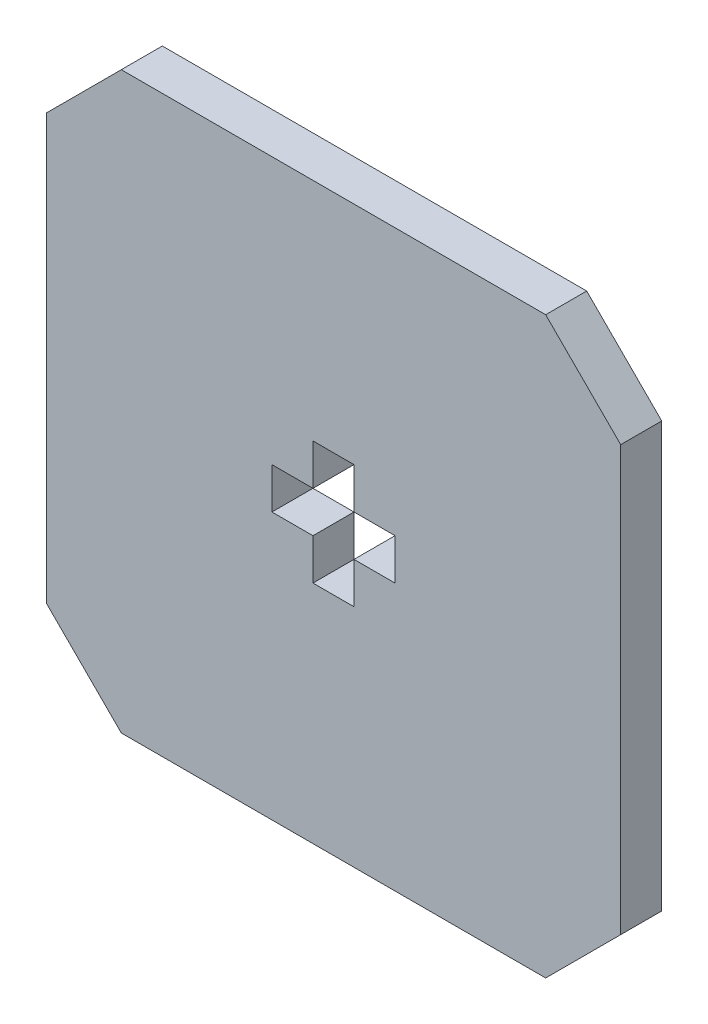
ISO-10303-21;
HEADER;
FILE_DESCRIPTION(('STEP AP214'),'2;1');
FILE_NAME('part.step','',(''),(''),'','','');
FILE_SCHEMA(('AUTOMOTIVE_DESIGN { 1 0 10303 214 1 1 1 1 }'));
ENDSEC;
DATA;
#1=APPLICATION_CONTEXT('core data for automotive mechanical design processes');
#2=APPLICATION_PROTOCOL_DEFINITION('international standard','automotive_design',2000,#1);
#3=PRODUCT_CONTEXT('',#1,'mechanical');
#4=PRODUCT('Part','Part','',(#3));
#5=PRODUCT_RELATED_PRODUCT_CATEGORY('part','',(#4));
#6=PRODUCT_DEFINITION_FORMATION('','',#4);
#7=PRODUCT_DEFINITION_CONTEXT('part definition',#1,'design');
#8=PRODUCT_DEFINITION('design','',#6,#7);
#9=PRODUCT_DEFINITION_SHAPE('','',#8);
#10=(LENGTH_UNIT() NAMED_UNIT(*) SI_UNIT(.MILLI.,.METRE.));
#11=(NAMED_UNIT(*) PLANE_ANGLE_UNIT() SI_UNIT($,.RADIAN.));
#12=(NAMED_UNIT(*) SI_UNIT($,.STERADIAN.) SOLID_ANGLE_UNIT());
#13=UNCERTAINTY_MEASURE_WITH_UNIT(LENGTH_MEASURE(1.E-05),#10,'distance_accuracy_value','');
#14=(GEOMETRIC_REPRESENTATION_CONTEXT(3) GLOBAL_UNCERTAINTY_ASSIGNED_CONTEXT((#13)) GLOBAL_UNIT_ASSIGNED_CONTEXT((#10,
#11,#12)) REPRESENTATION_CONTEXT('',''));
#15=CARTESIAN_POINT('',(0.,0.,0.));
#16=DIRECTION('',(0.,0.,1.));
#17=DIRECTION('',(1.,0.,0.));
#18=AXIS2_PLACEMENT_3D('',#15,#16,#17);
#19=CARTESIAN_POINT('',(0.,0.,3.));
#20=DIRECTION('',(0.,0.,-1.));
#21=DIRECTION('',(-1.,0.,0.));
#22=AXIS2_PLACEMENT_3D('',#19,#20,#21);
#23=PLANE('',#22);
#24=DIRECTION('',(0.707106781186548,0.707106781186548,0.));
#25=VECTOR('',#24,1.);
#26=CARTESIAN_POINT('',(432.000004860086,260.485276584416,3.));
#27=LINE('',#26,#25);
#28=CARTESIAN_POINT('',(426.514723485886,254.999995210216,3.));
#29=VERTEX_POINT('',#28);
#30=CARTESIAN_POINT('',(432.000004860086,260.485276584416,3.));
#31=VERTEX_POINT('',#30);
#32=EDGE_CURVE('E264',#29,#31,#27,.T.);
#33=ORIENTED_EDGE('',*,*,#32,.T.);
#34=DIRECTION('',(0.,1.,0.));
#35=VECTOR('',#34,1.);
#36=CARTESIAN_POINT('',(432.000004860086,291.514713836016,3.));
#37=LINE('',#36,#35);
#38=CARTESIAN_POINT('',(432.000004860086,291.514713836016,3.));
#39=VERTEX_POINT('',#38);
#40=EDGE_CURVE('E267',#31,#39,#37,.T.);
#41=ORIENTED_EDGE('',*,*,#40,.T.);
#42=DIRECTION('',(-0.707106781186544,0.707106781186551,0.));
#43=VECTOR('',#42,1.);
#44=CARTESIAN_POINT('',(426.514723485886,296.999995210216,3.));
#45=LINE('',#44,#43);
#46=CARTESIAN_POINT('',(426.514723485886,296.999995210216,3.));
#47=VERTEX_POINT('',#46);
#48=EDGE_CURVE('E270',#39,#47,#45,.T.);
#49=ORIENTED_EDGE('',*,*,#48,.T.);
#50=DIRECTION('',(-1.,0.,0.));
#51=VECTOR('',#50,1.);
#52=CARTESIAN_POINT('',(395.485286234286,296.999995210216,3.));
#53=LINE('',#52,#51);
#54=CARTESIAN_POINT('',(395.485286234286,296.999995210216,3.));
#55=VERTEX_POINT('',#54);
#56=EDGE_CURVE('E272',#47,#55,#53,.T.);
#57=ORIENTED_EDGE('',*,*,#56,.T.);
#58=DIRECTION('',(-0.707106781186544,-0.707106781186551,0.));
#59=VECTOR('',#58,1.);
#60=CARTESIAN_POINT('',(390.000004860086,291.514713836016,3.));
#61=LINE('',#60,#59);
#62=CARTESIAN_POINT('',(390.000004860086,291.514713836016,3.));
#63=VERTEX_POINT('',#62);
#64=EDGE_CURVE('E274',#55,#63,#61,.T.);
#65=ORIENTED_EDGE('',*,*,#64,.T.);
#66=DIRECTION('',(0.,-1.,0.));
#67=VECTOR('',#66,1.);
#68=CARTESIAN_POINT('',(390.000004860086,260.485276584416,3.));
#69=LINE('',#68,#67);
#70=CARTESIAN_POINT('',(390.000004860086,260.485276584416,3.));
#71=VERTEX_POINT('',#70);
#72=EDGE_CURVE('E276',#63,#71,#69,.T.);
#73=ORIENTED_EDGE('',*,*,#72,.T.);
#74=DIRECTION('',(0.707106781186548,-0.707106781186548,0.));
#75=VECTOR('',#74,1.);
#76=CARTESIAN_POINT('',(395.485286234286,254.999995210216,3.));
#77=LINE('',#76,#75);
#78=CARTESIAN_POINT('',(395.485286234286,254.999995210216,3.));
#79=VERTEX_POINT('',#78);
#80=EDGE_CURVE('E278',#71,#79,#77,.T.);
#81=ORIENTED_EDGE('',*,*,#80,.T.);
#82=DIRECTION('',(1.,0.,0.));
#83=VECTOR('',#82,1.);
#84=CARTESIAN_POINT('',(426.514723485886,254.999995210216,3.));
#85=LINE('',#84,#83);
#86=EDGE_CURVE('E280',#79,#29,#85,.T.);
#87=ORIENTED_EDGE('',*,*,#86,.T.);
#88=EDGE_LOOP('',(#33,#41,#49,#57,#65,#73,#81,#87));
#89=FACE_BOUND('',#88,.T.);
#90=DIRECTION('',(-1.,0.,0.));
#91=VECTOR('',#90,1.);
#92=CARTESIAN_POINT('',(409.500004860086,280.499995210216,3.));
#93=LINE('',#92,#91);
#94=CARTESIAN_POINT('',(412.500004860086,280.499995210216,3.));
#95=VERTEX_POINT('',#94);
#96=CARTESIAN_POINT('',(409.500004860086,280.499995210216,3.));
#97=VERTEX_POINT('',#96);
#98=EDGE_CURVE('E171',#95,#97,#93,.T.);
#99=ORIENTED_EDGE('',*,*,#98,.F.);
#100=DIRECTION('',(0.,1.,0.));
#101=VECTOR('',#100,1.);
#102=CARTESIAN_POINT('',(412.500004860086,280.499995210216,3.));
#103=LINE('',#102,#101);
#104=CARTESIAN_POINT('',(412.500004860086,277.499995210216,3.));
#105=VERTEX_POINT('',#104);
#106=EDGE_CURVE('E212',#105,#95,#103,.T.);
#107=ORIENTED_EDGE('',*,*,#106,.F.);
#108=DIRECTION('',(-1.,0.,0.));
#109=VECTOR('',#108,1.);
#110=CARTESIAN_POINT('',(412.500004860086,277.499995210216,3.));
#111=LINE('',#110,#109);
#112=CARTESIAN_POINT('',(415.500004860086,277.499995210216,3.));
#113=VERTEX_POINT('',#112);
#114=EDGE_CURVE('E210',#113,#105,#111,.T.);
#115=ORIENTED_EDGE('',*,*,#114,.F.);
#116=DIRECTION('',(0.,1.,0.));
#117=VECTOR('',#116,1.);
#118=CARTESIAN_POINT('',(415.500004860086,277.499995210216,3.));
#119=LINE('',#118,#117);
#120=CARTESIAN_POINT('',(415.500004860086,274.499995210216,3.));
#121=VERTEX_POINT('',#120);
#122=EDGE_CURVE('E208',#121,#113,#119,.T.);
#123=ORIENTED_EDGE('',*,*,#122,.F.);
#124=DIRECTION('',(1.,0.,0.));
#125=VECTOR('',#124,1.);
#126=CARTESIAN_POINT('',(415.500004860086,274.499995210216,3.));
#127=LINE('',#126,#125);
#128=CARTESIAN_POINT('',(412.500004860086,274.499995210216,3.));
#129=VERTEX_POINT('',#128);
#130=EDGE_CURVE('E206',#129,#121,#127,.T.);
#131=ORIENTED_EDGE('',*,*,#130,.F.);
#132=DIRECTION('',(0.,1.,0.));
#133=VECTOR('',#132,1.);
#134=CARTESIAN_POINT('',(412.500004860086,274.499995210216,3.));
#135=LINE('',#134,#133);
#136=CARTESIAN_POINT('',(412.500004860086,271.499995210216,3.));
#137=VERTEX_POINT('',#136);
#138=EDGE_CURVE('E204',#137,#129,#135,.T.);
#139=ORIENTED_EDGE('',*,*,#138,.F.);
#140=DIRECTION('',(1.,0.,0.));
#141=VECTOR('',#140,1.);
#142=CARTESIAN_POINT('',(412.500004860086,271.499995210216,3.));
#143=LINE('',#142,#141);
#144=CARTESIAN_POINT('',(409.500004860086,271.499995210216,3.));
#145=VERTEX_POINT('',#144);
#146=EDGE_CURVE('E202',#145,#137,#143,.T.);
#147=ORIENTED_EDGE('',*,*,#146,.F.);
#148=DIRECTION('',(0.,-1.,0.));
#149=VECTOR('',#148,1.);
#150=CARTESIAN_POINT('',(409.500004860086,271.499995210216,3.));
#151=LINE('',#150,#149);
#152=CARTESIAN_POINT('',(409.500004860086,274.499995210216,3.));
#153=VERTEX_POINT('',#152);
#154=EDGE_CURVE('E200',#153,#145,#151,.T.);
#155=ORIENTED_EDGE('',*,*,#154,.F.);
#156=DIRECTION('',(1.,0.,0.));
#157=VECTOR('',#156,1.);
#158=CARTESIAN_POINT('',(409.500004860086,274.499995210216,3.));
#159=LINE('',#158,#157);
#160=CARTESIAN_POINT('',(406.500004860086,274.499995210216,3.));
#161=VERTEX_POINT('',#160);
#162=EDGE_CURVE('E198',#161,#153,#159,.T.);
#163=ORIENTED_EDGE('',*,*,#162,.F.);
#164=DIRECTION('',(0.,-1.,0.));
#165=VECTOR('',#164,1.);
#166=CARTESIAN_POINT('',(406.500004860086,274.499995210216,3.));
#167=LINE('',#166,#165);
#168=CARTESIAN_POINT('',(406.500004860086,277.499995210216,3.));
#169=VERTEX_POINT('',#168);
#170=EDGE_CURVE('E194',#169,#161,#167,.T.);
#171=ORIENTED_EDGE('',*,*,#170,.F.);
#172=DIRECTION('',(-1.,0.,0.));
#173=VECTOR('',#172,1.);
#174=CARTESIAN_POINT('',(406.500004860086,277.499995210216,3.));
#175=LINE('',#174,#173);
#176=CARTESIAN_POINT('',(409.500004860086,277.499995210216,3.));
#177=VERTEX_POINT('',#176);
#178=EDGE_CURVE('E192',#177,#169,#175,.T.);
#179=ORIENTED_EDGE('',*,*,#178,.F.);
#180=DIRECTION('',(0.,-1.,0.));
#181=VECTOR('',#180,1.);
#182=CARTESIAN_POINT('',(409.500004860086,277.499995210216,3.));
#183=LINE('',#182,#181);
#184=EDGE_CURVE('E179',#97,#177,#183,.T.);
#185=ORIENTED_EDGE('',*,*,#184,.F.);
#186=EDGE_LOOP('',(#99,#107,#115,#123,#131,#139,#147,#155,#163,#171,#179,#185));
#187=FACE_BOUND('',#186,.T.);
#188=ADVANCED_FACE('F34',(#89,#187),#23,.F.);
#189=CARTESIAN_POINT('',(0.,0.,0.));
#190=DIRECTION('',(0.,0.,-1.));
#191=DIRECTION('',(-1.,0.,0.));
#192=AXIS2_PLACEMENT_3D('',#189,#190,#191);
#193=PLANE('',#192);
#194=DIRECTION('',(0.707106781186548,0.707106781186548,0.));
#195=VECTOR('',#194,1.);
#196=CARTESIAN_POINT('',(432.000004860086,260.485276584416,0.));
#197=LINE('',#196,#195);
#198=CARTESIAN_POINT('',(426.514723485886,254.999995210216,0.));
#199=VERTEX_POINT('',#198);
#200=CARTESIAN_POINT('',(432.000004860086,260.485276584416,0.));
#201=VERTEX_POINT('',#200);
#202=EDGE_CURVE('E187',#199,#201,#197,.T.);
#203=ORIENTED_EDGE('',*,*,#202,.F.);
#204=DIRECTION('',(1.,0.,0.));
#205=VECTOR('',#204,1.);
#206=CARTESIAN_POINT('',(426.514723485886,254.999995210216,0.));
#207=LINE('',#206,#205);
#208=CARTESIAN_POINT('',(395.485286234286,254.999995210216,0.));
#209=VERTEX_POINT('',#208);
#210=EDGE_CURVE('E268',#209,#199,#207,.T.);
#211=ORIENTED_EDGE('',*,*,#210,.F.);
#212=DIRECTION('',(0.707106781186548,-0.707106781186548,0.));
#213=VECTOR('',#212,1.);
#214=CARTESIAN_POINT('',(395.485286234286,254.999995210216,0.));
#215=LINE('',#214,#213);
#216=CARTESIAN_POINT('',(390.000004860086,260.485276584416,0.));
#217=VERTEX_POINT('',#216);
#218=EDGE_CURVE('E295',#217,#209,#215,.T.);
#219=ORIENTED_EDGE('',*,*,#218,.F.);
#220=DIRECTION('',(0.,-1.,0.));
#221=VECTOR('',#220,1.);
#222=CARTESIAN_POINT('',(390.000004860086,260.485276584416,0.));
#223=LINE('',#222,#221);
#224=CARTESIAN_POINT('',(390.000004860086,291.514713836016,0.));
#225=VERTEX_POINT('',#224);
#226=EDGE_CURVE('E293',#225,#217,#223,.T.);
#227=ORIENTED_EDGE('',*,*,#226,.F.);
#228=DIRECTION('',(-0.707106781186544,-0.707106781186551,0.));
#229=VECTOR('',#228,1.);
#230=CARTESIAN_POINT('',(390.000004860086,291.514713836016,0.));
#231=LINE('',#230,#229);
#232=CARTESIAN_POINT('',(395.485286234286,296.999995210216,0.));
#233=VERTEX_POINT('',#232);
#234=EDGE_CURVE('E291',#233,#225,#231,.T.);
#235=ORIENTED_EDGE('',*,*,#234,.F.);
#236=DIRECTION('',(-1.,0.,0.));
#237=VECTOR('',#236,1.);
#238=CARTESIAN_POINT('',(395.485286234286,296.999995210216,0.));
#239=LINE('',#238,#237);
#240=CARTESIAN_POINT('',(426.514723485886,296.999995210216,0.));
#241=VERTEX_POINT('',#240);
#242=EDGE_CURVE('E289',#241,#233,#239,.T.);
#243=ORIENTED_EDGE('',*,*,#242,.F.);
#244=DIRECTION('',(-0.707106781186544,0.707106781186551,0.));
#245=VECTOR('',#244,1.);
#246=CARTESIAN_POINT('',(426.514723485886,296.999995210216,0.));
#247=LINE('',#246,#245);
#248=CARTESIAN_POINT('',(432.000004860086,291.514713836016,0.));
#249=VERTEX_POINT('',#248);
#250=EDGE_CURVE('E287',#249,#241,#247,.T.);
#251=ORIENTED_EDGE('',*,*,#250,.F.);
#252=DIRECTION('',(0.,1.,0.));
#253=VECTOR('',#252,1.);
#254=CARTESIAN_POINT('',(432.000004860086,291.514713836016,0.));
#255=LINE('',#254,#253);
#256=EDGE_CURVE('E285',#201,#249,#255,.T.);
#257=ORIENTED_EDGE('',*,*,#256,.F.);
#258=EDGE_LOOP('',(#203,#211,#219,#227,#235,#243,#251,#257));
#259=FACE_BOUND('',#258,.T.);
#260=DIRECTION('',(0.,1.,0.));
#261=VECTOR('',#260,1.);
#262=CARTESIAN_POINT('',(412.500004860086,280.499995210216,0.));
#263=LINE('',#262,#261);
#264=CARTESIAN_POINT('',(412.500004860086,277.499995210216,0.));
#265=VERTEX_POINT('',#264);
#266=CARTESIAN_POINT('',(412.500004860086,280.499995210216,0.));
#267=VERTEX_POINT('',#266);
#268=EDGE_CURVE('E180',#265,#267,#263,.T.);
#269=ORIENTED_EDGE('',*,*,#268,.T.);
#270=DIRECTION('',(-1.,0.,0.));
#271=VECTOR('',#270,1.);
#272=CARTESIAN_POINT('',(409.500004860086,280.499995210216,0.));
#273=LINE('',#272,#271);
#274=CARTESIAN_POINT('',(409.500004860086,280.499995210216,0.));
#275=VERTEX_POINT('',#274);
#276=EDGE_CURVE('E57',#267,#275,#273,.T.);
#277=ORIENTED_EDGE('',*,*,#276,.T.);
#278=DIRECTION('',(0.,-1.,0.));
#279=VECTOR('',#278,1.);
#280=CARTESIAN_POINT('',(409.500004860086,277.499995210216,0.));
#281=LINE('',#280,#279);
#282=CARTESIAN_POINT('',(409.500004860086,277.499995210216,0.));
#283=VERTEX_POINT('',#282);
#284=EDGE_CURVE('E186',#275,#283,#281,.T.);
#285=ORIENTED_EDGE('',*,*,#284,.T.);
#286=DIRECTION('',(-1.,0.,0.));
#287=VECTOR('',#286,1.);
#288=CARTESIAN_POINT('',(406.500004860086,277.499995210216,0.));
#289=LINE('',#288,#287);
#290=CARTESIAN_POINT('',(406.500004860086,277.499995210216,0.));
#291=VERTEX_POINT('',#290);
#292=EDGE_CURVE('E216',#283,#291,#289,.T.);
#293=ORIENTED_EDGE('',*,*,#292,.T.);
#294=DIRECTION('',(0.,-1.,0.));
#295=VECTOR('',#294,1.);
#296=CARTESIAN_POINT('',(406.500004860086,274.499995210216,0.));
#297=LINE('',#296,#295);
#298=CARTESIAN_POINT('',(406.500004860086,274.499995210216,0.));
#299=VERTEX_POINT('',#298);
#300=EDGE_CURVE('E219',#291,#299,#297,.T.);
#301=ORIENTED_EDGE('',*,*,#300,.T.);
#302=DIRECTION('',(1.,0.,0.));
#303=VECTOR('',#302,1.);
#304=CARTESIAN_POINT('',(409.500004860086,274.499995210216,0.));
#305=LINE('',#304,#303);
#306=CARTESIAN_POINT('',(409.500004860086,274.499995210216,0.));
#307=VERTEX_POINT('',#306);
#308=EDGE_CURVE('E222',#299,#307,#305,.T.);
#309=ORIENTED_EDGE('',*,*,#308,.T.);
#310=DIRECTION('',(0.,-1.,0.));
#311=VECTOR('',#310,1.);
#312=CARTESIAN_POINT('',(409.500004860086,271.499995210216,0.));
#313=LINE('',#312,#311);
#314=CARTESIAN_POINT('',(409.500004860086,271.499995210216,0.));
#315=VERTEX_POINT('',#314);
#316=EDGE_CURVE('E225',#307,#315,#313,.T.);
#317=ORIENTED_EDGE('',*,*,#316,.T.);
#318=DIRECTION('',(1.,0.,0.));
#319=VECTOR('',#318,1.);
#320=CARTESIAN_POINT('',(412.500004860086,271.499995210216,0.));
#321=LINE('',#320,#319);
#322=CARTESIAN_POINT('',(412.500004860086,271.499995210216,0.));
#323=VERTEX_POINT('',#322);
#324=EDGE_CURVE('E228',#315,#323,#321,.T.);
#325=ORIENTED_EDGE('',*,*,#324,.T.);
#326=DIRECTION('',(0.,1.,0.));
#327=VECTOR('',#326,1.);
#328=CARTESIAN_POINT('',(412.500004860086,274.499995210216,0.));
#329=LINE('',#328,#327);
#330=CARTESIAN_POINT('',(412.500004860086,274.499995210216,0.));
#331=VERTEX_POINT('',#330);
#332=EDGE_CURVE('E231',#323,#331,#329,.T.);
#333=ORIENTED_EDGE('',*,*,#332,.T.);
#334=DIRECTION('',(1.,0.,0.));
#335=VECTOR('',#334,1.);
#336=CARTESIAN_POINT('',(415.500004860086,274.499995210216,0.));
#337=LINE('',#336,#335);
#338=CARTESIAN_POINT('',(415.500004860086,274.499995210216,0.));
#339=VERTEX_POINT('',#338);
#340=EDGE_CURVE('E234',#331,#339,#337,.T.);
#341=ORIENTED_EDGE('',*,*,#340,.T.);
#342=DIRECTION('',(0.,1.,0.));
#343=VECTOR('',#342,1.);
#344=CARTESIAN_POINT('',(415.500004860086,277.499995210216,0.));
#345=LINE('',#344,#343);
#346=CARTESIAN_POINT('',(415.500004860086,277.499995210216,0.));
#347=VERTEX_POINT('',#346);
#348=EDGE_CURVE('E237',#339,#347,#345,.T.);
#349=ORIENTED_EDGE('',*,*,#348,.T.);
#350=DIRECTION('',(-1.,0.,0.));
#351=VECTOR('',#350,1.);
#352=CARTESIAN_POINT('',(412.500004860086,277.499995210216,0.));
#353=LINE('',#352,#351);
#354=EDGE_CURVE('E240',#347,#265,#353,.T.);
#355=ORIENTED_EDGE('',*,*,#354,.T.);
#356=EDGE_LOOP('',(#269,#277,#285,#293,#301,#309,#317,#325,#333,#341,#349,#355));
#357=FACE_BOUND('',#356,.T.);
#358=ADVANCED_FACE('F325',(#259,#357),#193,.T.);
#359=CARTESIAN_POINT('',(432.000004860086,260.485276584416,3.));
#360=DIRECTION('',(-0.707106781186547,0.707106781186547,0.));
#361=DIRECTION('',(-0.707106781186548,-0.707106781186548,0.));
#362=AXIS2_PLACEMENT_3D('',#359,#360,#361);
#363=PLANE('',#362);
#364=ORIENTED_EDGE('',*,*,#202,.T.);
#365=DIRECTION('',(0.,0.,-1.));
#366=VECTOR('',#365,1.);
#367=CARTESIAN_POINT('',(432.000004860086,260.485276584416,3.));
#368=LINE('',#367,#366);
#369=EDGE_CURVE('E11',#31,#201,#368,.T.);
#370=ORIENTED_EDGE('',*,*,#369,.F.);
#371=ORIENTED_EDGE('',*,*,#32,.F.);
#372=DIRECTION('',(0.,0.,-1.));
#373=VECTOR('',#372,1.);
#374=CARTESIAN_POINT('',(426.514723485886,254.999995210216,3.));
#375=LINE('',#374,#373);
#376=EDGE_CURVE('E282',#29,#199,#375,.T.);
#377=ORIENTED_EDGE('',*,*,#376,.T.);
#378=EDGE_LOOP('',(#364,#370,#371,#377));
#379=FACE_BOUND('',#378,.T.);
#380=ADVANCED_FACE('F36',(#379),#363,.F.);
#381=CARTESIAN_POINT('',(432.000004860086,291.514713836016,3.));
#382=DIRECTION('',(-1.,0.,0.));
#383=DIRECTION('',(0.,0.,1.));
#384=AXIS2_PLACEMENT_3D('',#381,#382,#383);
#385=PLANE('',#384);
#386=ORIENTED_EDGE('',*,*,#256,.T.);
#387=DIRECTION('',(0.,0.,-1.));
#388=VECTOR('',#387,1.);
#389=CARTESIAN_POINT('',(432.000004860086,291.514713836016,3.));
#390=LINE('',#389,#388);
#391=EDGE_CURVE('E42',#39,#249,#390,.T.);
#392=ORIENTED_EDGE('',*,*,#391,.F.);
#393=ORIENTED_EDGE('',*,*,#40,.F.);
#394=ORIENTED_EDGE('',*,*,#369,.T.);
#395=EDGE_LOOP('',(#386,#392,#393,#394));
#396=FACE_BOUND('',#395,.T.);
#397=ADVANCED_FACE('F342',(#396),#385,.F.);
#398=CARTESIAN_POINT('',(426.514723485886,296.999995210216,3.));
#399=DIRECTION('',(-0.707106781186551,-0.707106781186544,0.));
#400=DIRECTION('',(0.707106781186544,-0.707106781186551,0.));
#401=AXIS2_PLACEMENT_3D('',#398,#399,#400);
#402=PLANE('',#401);
#403=ORIENTED_EDGE('',*,*,#250,.T.);
#404=DIRECTION('',(0.,0.,-1.));
#405=VECTOR('',#404,1.);
#406=CARTESIAN_POINT('',(426.514723485886,296.999995210216,3.));
#407=LINE('',#406,#405);
#408=EDGE_CURVE('E312',#47,#241,#407,.T.);
#409=ORIENTED_EDGE('',*,*,#408,.F.);
#410=ORIENTED_EDGE('',*,*,#48,.F.);
#411=ORIENTED_EDGE('',*,*,#391,.T.);
#412=EDGE_LOOP('',(#403,#409,#410,#411));
#413=FACE_BOUND('',#412,.T.);
#414=ADVANCED_FACE('F319',(#413),#402,.F.);
#415=CARTESIAN_POINT('',(395.485286234286,296.999995210216,3.));
#416=DIRECTION('',(0.,-1.,0.));
#417=DIRECTION('',(0.,0.,-1.));
#418=AXIS2_PLACEMENT_3D('',#415,#416,#417);
#419=PLANE('',#418);
#420=ORIENTED_EDGE('',*,*,#242,.T.);
#421=DIRECTION('',(0.,0.,-1.));
#422=VECTOR('',#421,1.);
#423=CARTESIAN_POINT('',(395.485286234286,296.999995210216,3.));
#424=LINE('',#423,#422);
#425=EDGE_CURVE('E309',#55,#233,#424,.T.);
#426=ORIENTED_EDGE('',*,*,#425,.F.);
#427=ORIENTED_EDGE('',*,*,#56,.F.);
#428=ORIENTED_EDGE('',*,*,#408,.T.);
#429=EDGE_LOOP('',(#420,#426,#427,#428));
#430=FACE_BOUND('',#429,.T.);
#431=ADVANCED_FACE('F331',(#430),#419,.F.);
#432=CARTESIAN_POINT('',(390.000004860086,291.514713836016,3.));
#433=DIRECTION('',(0.707106781186551,-0.707106781186544,0.));
#434=DIRECTION('',(0.707106781186544,0.707106781186551,0.));
#435=AXIS2_PLACEMENT_3D('',#432,#433,#434);
#436=PLANE('',#435);
#437=ORIENTED_EDGE('',*,*,#234,.T.);
#438=DIRECTION('',(0.,0.,-1.));
#439=VECTOR('',#438,1.);
#440=CARTESIAN_POINT('',(390.000004860086,291.514713836016,3.));
#441=LINE('',#440,#439);
#442=EDGE_CURVE('E306',#63,#225,#441,.T.);
#443=ORIENTED_EDGE('',*,*,#442,.F.);
#444=ORIENTED_EDGE('',*,*,#64,.F.);
#445=ORIENTED_EDGE('',*,*,#425,.T.);
#446=EDGE_LOOP('',(#437,#443,#444,#445));
#447=FACE_BOUND('',#446,.T.);
#448=ADVANCED_FACE('F335',(#447),#436,.F.);
#449=CARTESIAN_POINT('',(390.000004860086,260.485276584416,3.));
#450=DIRECTION('',(1.,0.,0.));
#451=DIRECTION('',(0.,0.,-1.));
#452=AXIS2_PLACEMENT_3D('',#449,#450,#451);
#453=PLANE('',#452);
#454=ORIENTED_EDGE('',*,*,#226,.T.);
#455=DIRECTION('',(0.,0.,-1.));
#456=VECTOR('',#455,1.);
#457=CARTESIAN_POINT('',(390.000004860086,260.485276584416,3.));
#458=LINE('',#457,#456);
#459=EDGE_CURVE('E303',#71,#217,#458,.T.);
#460=ORIENTED_EDGE('',*,*,#459,.F.);
#461=ORIENTED_EDGE('',*,*,#72,.F.);
#462=ORIENTED_EDGE('',*,*,#442,.T.);
#463=EDGE_LOOP('',(#454,#460,#461,#462));
#464=FACE_BOUND('',#463,.T.);
#465=ADVANCED_FACE('F355',(#464),#453,.F.);
#466=CARTESIAN_POINT('',(395.485286234286,254.999995210216,3.));
#467=DIRECTION('',(0.707106781186547,0.707106781186547,0.));
#468=DIRECTION('',(-0.707106781186548,0.707106781186548,0.));
#469=AXIS2_PLACEMENT_3D('',#466,#467,#468);
#470=PLANE('',#469);
#471=ORIENTED_EDGE('',*,*,#218,.T.);
#472=DIRECTION('',(0.,0.,-1.));
#473=VECTOR('',#472,1.);
#474=CARTESIAN_POINT('',(395.485286234286,254.999995210216,3.));
#475=LINE('',#474,#473);
#476=EDGE_CURVE('E300',#79,#209,#475,.T.);
#477=ORIENTED_EDGE('',*,*,#476,.F.);
#478=ORIENTED_EDGE('',*,*,#80,.F.);
#479=ORIENTED_EDGE('',*,*,#459,.T.);
#480=EDGE_LOOP('',(#471,#477,#478,#479));
#481=FACE_BOUND('',#480,.T.);
#482=ADVANCED_FACE('F353',(#481),#470,.F.);
#483=CARTESIAN_POINT('',(426.514723485886,254.999995210216,3.));
#484=DIRECTION('',(0.,1.,0.));
#485=DIRECTION('',(0.,0.,1.));
#486=AXIS2_PLACEMENT_3D('',#483,#484,#485);
#487=PLANE('',#486);
#488=ORIENTED_EDGE('',*,*,#210,.T.);
#489=ORIENTED_EDGE('',*,*,#376,.F.);
#490=ORIENTED_EDGE('',*,*,#86,.F.);
#491=ORIENTED_EDGE('',*,*,#476,.T.);
#492=EDGE_LOOP('',(#488,#489,#490,#491));
#493=FACE_BOUND('',#492,.T.);
#494=ADVANCED_FACE('F348',(#493),#487,.F.);
#495=CARTESIAN_POINT('',(409.500004860086,280.499995210216,3.));
#496=DIRECTION('',(0.,-1.,0.));
#497=DIRECTION('',(0.,0.,-1.));
#498=AXIS2_PLACEMENT_3D('',#495,#496,#497);
#499=PLANE('',#498);
#500=ORIENTED_EDGE('',*,*,#276,.F.);
#501=DIRECTION('',(0.,0.,-1.));
#502=VECTOR('',#501,1.);
#503=CARTESIAN_POINT('',(412.500004860086,280.499995210216,3.));
#504=LINE('',#503,#502);
#505=EDGE_CURVE('E175',#95,#267,#504,.T.);
#506=ORIENTED_EDGE('',*,*,#505,.F.);
#507=ORIENTED_EDGE('',*,*,#98,.T.);
#508=DIRECTION('',(0.,0.,-1.));
#509=VECTOR('',#508,1.);
#510=CARTESIAN_POINT('',(409.500004860086,280.499995210216,3.));
#511=LINE('',#510,#509);
#512=EDGE_CURVE('E174',#97,#275,#511,.T.);
#513=ORIENTED_EDGE('',*,*,#512,.T.);
#514=EDGE_LOOP('',(#500,#506,#507,#513));
#515=FACE_BOUND('',#514,.T.);
#516=ADVANCED_FACE('F173',(#515),#499,.T.);
#517=CARTESIAN_POINT('',(409.500004860086,277.499995210216,3.));
#518=DIRECTION('',(1.,0.,0.));
#519=DIRECTION('',(0.,0.,-1.));
#520=AXIS2_PLACEMENT_3D('',#517,#518,#519);
#521=PLANE('',#520);
#522=ORIENTED_EDGE('',*,*,#284,.F.);
#523=ORIENTED_EDGE('',*,*,#512,.F.);
#524=ORIENTED_EDGE('',*,*,#184,.T.);
#525=DIRECTION('',(0.,0.,-1.));
#526=VECTOR('',#525,1.);
#527=CARTESIAN_POINT('',(409.500004860086,277.499995210216,3.));
#528=LINE('',#527,#526);
#529=EDGE_CURVE('E188',#177,#283,#528,.T.);
#530=ORIENTED_EDGE('',*,*,#529,.T.);
#531=EDGE_LOOP('',(#522,#523,#524,#530));
#532=FACE_BOUND('',#531,.T.);
#533=ADVANCED_FACE('F183',(#532),#521,.T.);
#534=CARTESIAN_POINT('',(406.500004860086,277.499995210216,3.));
#535=DIRECTION('',(0.,-1.,0.));
#536=DIRECTION('',(0.,0.,-1.));
#537=AXIS2_PLACEMENT_3D('',#534,#535,#536);
#538=PLANE('',#537);
#539=ORIENTED_EDGE('',*,*,#292,.F.);
#540=ORIENTED_EDGE('',*,*,#529,.F.);
#541=ORIENTED_EDGE('',*,*,#178,.T.);
#542=DIRECTION('',(0.,0.,-1.));
#543=VECTOR('',#542,1.);
#544=CARTESIAN_POINT('',(406.500004860086,277.499995210216,3.));
#545=LINE('',#544,#543);
#546=EDGE_CURVE('E261',#169,#291,#545,.T.);
#547=ORIENTED_EDGE('',*,*,#546,.T.);
#548=EDGE_LOOP('',(#539,#540,#541,#547));
#549=FACE_BOUND('',#548,.T.);
#550=ADVANCED_FACE('F380',(#549),#538,.T.);
#551=CARTESIAN_POINT('',(406.500004860086,274.499995210216,3.));
#552=DIRECTION('',(1.,0.,0.));
#553=DIRECTION('',(0.,0.,-1.));
#554=AXIS2_PLACEMENT_3D('',#551,#552,#553);
#555=PLANE('',#554);
#556=ORIENTED_EDGE('',*,*,#300,.F.);
#557=ORIENTED_EDGE('',*,*,#546,.F.);
#558=ORIENTED_EDGE('',*,*,#170,.T.);
#559=DIRECTION('',(0.,0.,-1.));
#560=VECTOR('',#559,1.);
#561=CARTESIAN_POINT('',(406.500004860086,274.499995210216,3.));
#562=LINE('',#561,#560);
#563=EDGE_CURVE('E259',#161,#299,#562,.T.);
#564=ORIENTED_EDGE('',*,*,#563,.T.);
#565=EDGE_LOOP('',(#556,#557,#558,#564));
#566=FACE_BOUND('',#565,.T.);
#567=ADVANCED_FACE('F384',(#566),#555,.T.);
#568=CARTESIAN_POINT('',(409.500004860086,274.499995210216,3.));
#569=DIRECTION('',(0.,1.,0.));
#570=DIRECTION('',(0.,0.,1.));
#571=AXIS2_PLACEMENT_3D('',#568,#569,#570);
#572=PLANE('',#571);
#573=ORIENTED_EDGE('',*,*,#308,.F.);
#574=ORIENTED_EDGE('',*,*,#563,.F.);
#575=ORIENTED_EDGE('',*,*,#162,.T.);
#576=DIRECTION('',(0.,0.,-1.));
#577=VECTOR('',#576,1.);
#578=CARTESIAN_POINT('',(409.500004860086,274.499995210216,3.));
#579=LINE('',#578,#577);
#580=EDGE_CURVE('E257',#153,#307,#579,.T.);
#581=ORIENTED_EDGE('',*,*,#580,.T.);
#582=EDGE_LOOP('',(#573,#574,#575,#581));
#583=FACE_BOUND('',#582,.T.);
#584=ADVANCED_FACE('F390',(#583),#572,.T.);
#585=CARTESIAN_POINT('',(409.500004860086,271.499995210216,3.));
#586=DIRECTION('',(1.,0.,0.));
#587=DIRECTION('',(0.,0.,-1.));
#588=AXIS2_PLACEMENT_3D('',#585,#586,#587);
#589=PLANE('',#588);
#590=ORIENTED_EDGE('',*,*,#316,.F.);
#591=ORIENTED_EDGE('',*,*,#580,.F.);
#592=ORIENTED_EDGE('',*,*,#154,.T.);
#593=DIRECTION('',(0.,0.,-1.));
#594=VECTOR('',#593,1.);
#595=CARTESIAN_POINT('',(409.500004860086,271.499995210216,3.));
#596=LINE('',#595,#594);
#597=EDGE_CURVE('E255',#145,#315,#596,.T.);
#598=ORIENTED_EDGE('',*,*,#597,.T.);
#599=EDGE_LOOP('',(#590,#591,#592,#598));
#600=FACE_BOUND('',#599,.T.);
#601=ADVANCED_FACE('F394',(#600),#589,.T.);
#602=CARTESIAN_POINT('',(412.500004860086,271.499995210216,3.));
#603=DIRECTION('',(0.,1.,0.));
#604=DIRECTION('',(0.,0.,1.));
#605=AXIS2_PLACEMENT_3D('',#602,#603,#604);
#606=PLANE('',#605);
#607=ORIENTED_EDGE('',*,*,#324,.F.);
#608=ORIENTED_EDGE('',*,*,#597,.F.);
#609=ORIENTED_EDGE('',*,*,#146,.T.);
#610=DIRECTION('',(0.,0.,-1.));
#611=VECTOR('',#610,1.);
#612=CARTESIAN_POINT('',(412.500004860086,271.499995210216,3.));
#613=LINE('',#612,#611);
#614=EDGE_CURVE('E253',#137,#323,#613,.T.);
#615=ORIENTED_EDGE('',*,*,#614,.T.);
#616=EDGE_LOOP('',(#607,#608,#609,#615));
#617=FACE_BOUND('',#616,.T.);
#618=ADVANCED_FACE('F398',(#617),#606,.T.);
#619=CARTESIAN_POINT('',(412.500004860086,274.499995210216,3.));
#620=DIRECTION('',(-1.,0.,0.));
#621=DIRECTION('',(0.,0.,1.));
#622=AXIS2_PLACEMENT_3D('',#619,#620,#621);
#623=PLANE('',#622);
#624=ORIENTED_EDGE('',*,*,#332,.F.);
#625=ORIENTED_EDGE('',*,*,#614,.F.);
#626=ORIENTED_EDGE('',*,*,#138,.T.);
#627=DIRECTION('',(0.,0.,-1.));
#628=VECTOR('',#627,1.);
#629=CARTESIAN_POINT('',(412.500004860086,274.499995210216,3.));
#630=LINE('',#629,#628);
#631=EDGE_CURVE('E251',#129,#331,#630,.T.);
#632=ORIENTED_EDGE('',*,*,#631,.T.);
#633=EDGE_LOOP('',(#624,#625,#626,#632));
#634=FACE_BOUND('',#633,.T.);
#635=ADVANCED_FACE('F402',(#634),#623,.T.);
#636=CARTESIAN_POINT('',(415.500004860086,274.499995210216,3.));
#637=DIRECTION('',(0.,1.,0.));
#638=DIRECTION('',(0.,0.,1.));
#639=AXIS2_PLACEMENT_3D('',#636,#637,#638);
#640=PLANE('',#639);
#641=ORIENTED_EDGE('',*,*,#340,.F.);
#642=ORIENTED_EDGE('',*,*,#631,.F.);
#643=ORIENTED_EDGE('',*,*,#130,.T.);
#644=DIRECTION('',(0.,0.,-1.));
#645=VECTOR('',#644,1.);
#646=CARTESIAN_POINT('',(415.500004860086,274.499995210216,3.));
#647=LINE('',#646,#645);
#648=EDGE_CURVE('E249',#121,#339,#647,.T.);
#649=ORIENTED_EDGE('',*,*,#648,.T.);
#650=EDGE_LOOP('',(#641,#642,#643,#649));
#651=FACE_BOUND('',#650,.T.);
#652=ADVANCED_FACE('F406',(#651),#640,.T.);
#653=CARTESIAN_POINT('',(415.500004860086,277.499995210216,3.));
#654=DIRECTION('',(-1.,0.,0.));
#655=DIRECTION('',(0.,0.,1.));
#656=AXIS2_PLACEMENT_3D('',#653,#654,#655);
#657=PLANE('',#656);
#658=ORIENTED_EDGE('',*,*,#348,.F.);
#659=ORIENTED_EDGE('',*,*,#648,.F.);
#660=ORIENTED_EDGE('',*,*,#122,.T.);
#661=DIRECTION('',(0.,0.,-1.));
#662=VECTOR('',#661,1.);
#663=CARTESIAN_POINT('',(415.500004860086,277.499995210216,3.));
#664=LINE('',#663,#662);
#665=EDGE_CURVE('E247',#113,#347,#664,.T.);
#666=ORIENTED_EDGE('',*,*,#665,.T.);
#667=EDGE_LOOP('',(#658,#659,#660,#666));
#668=FACE_BOUND('',#667,.T.);
#669=ADVANCED_FACE('F410',(#668),#657,.T.);
#670=CARTESIAN_POINT('',(412.500004860086,277.499995210216,3.));
#671=DIRECTION('',(0.,-1.,0.));
#672=DIRECTION('',(0.,0.,-1.));
#673=AXIS2_PLACEMENT_3D('',#670,#671,#672);
#674=PLANE('',#673);
#675=ORIENTED_EDGE('',*,*,#354,.F.);
#676=ORIENTED_EDGE('',*,*,#665,.F.);
#677=ORIENTED_EDGE('',*,*,#114,.T.);
#678=DIRECTION('',(0.,0.,-1.));
#679=VECTOR('',#678,1.);
#680=CARTESIAN_POINT('',(412.500004860086,277.499995210216,3.));
#681=LINE('',#680,#679);
#682=EDGE_CURVE('E49',#105,#265,#681,.T.);
#683=ORIENTED_EDGE('',*,*,#682,.T.);
#684=EDGE_LOOP('',(#675,#676,#677,#683));
#685=FACE_BOUND('',#684,.T.);
#686=ADVANCED_FACE('F414',(#685),#674,.T.);
#687=CARTESIAN_POINT('',(412.500004860086,280.499995210216,3.));
#688=DIRECTION('',(-1.,0.,0.));
#689=DIRECTION('',(0.,0.,1.));
#690=AXIS2_PLACEMENT_3D('',#687,#688,#689);
#691=PLANE('',#690);
#692=ORIENTED_EDGE('',*,*,#268,.F.);
#693=ORIENTED_EDGE('',*,*,#682,.F.);
#694=ORIENTED_EDGE('',*,*,#106,.T.);
#695=ORIENTED_EDGE('',*,*,#505,.T.);
#696=EDGE_LOOP('',(#692,#693,#694,#695));
#697=FACE_BOUND('',#696,.T.);
#698=ADVANCED_FACE('F418',(#697),#691,.T.);
#699=CLOSED_SHELL('',(#188,#358,#380,#397,#414,#431,#448,#465,#482,#494,#516,#533,#550,#567,
#584,#601,#618,#635,#652,#669,#686,#698));
#700=MANIFOLD_SOLID_BREP('B2',#699);
#701=ADVANCED_BREP_SHAPE_REPRESENTATION('',(#18,#700),#14);
#702=SHAPE_DEFINITION_REPRESENTATION(#9,#701);
ENDSEC;
END-ISO-10303-21;
